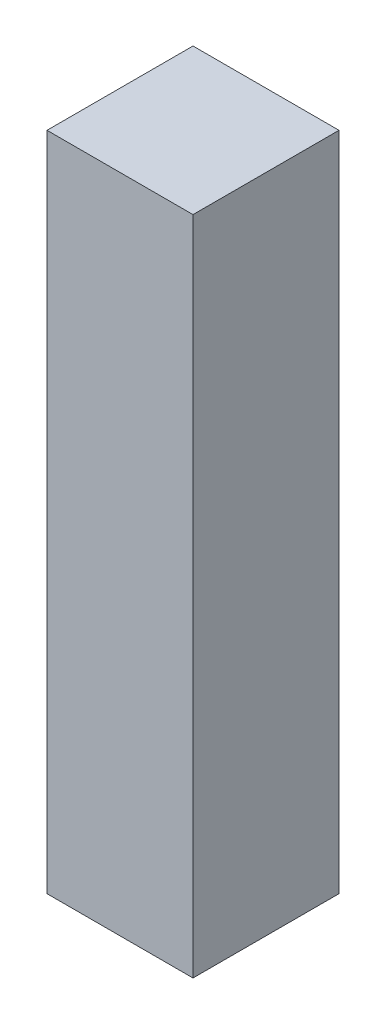
ISO-10303-21;
HEADER;
FILE_DESCRIPTION(('STEP AP214'),'2;1');
FILE_NAME('part.step','',(''),(''),'','','');
FILE_SCHEMA(('AUTOMOTIVE_DESIGN { 1 0 10303 214 1 1 1 1 }'));
ENDSEC;
DATA;
#1=APPLICATION_CONTEXT('core data for automotive mechanical design processes');
#2=APPLICATION_PROTOCOL_DEFINITION('international standard','automotive_design',2000,#1);
#3=PRODUCT_CONTEXT('',#1,'mechanical');
#4=PRODUCT('Part','Part','',(#3));
#5=PRODUCT_RELATED_PRODUCT_CATEGORY('part','',(#4));
#6=PRODUCT_DEFINITION_FORMATION('','',#4);
#7=PRODUCT_DEFINITION_CONTEXT('part definition',#1,'design');
#8=PRODUCT_DEFINITION('design','',#6,#7);
#9=PRODUCT_DEFINITION_SHAPE('','',#8);
#10=(LENGTH_UNIT() NAMED_UNIT(*) SI_UNIT(.MILLI.,.METRE.));
#11=(NAMED_UNIT(*) PLANE_ANGLE_UNIT() SI_UNIT($,.RADIAN.));
#12=(NAMED_UNIT(*) SI_UNIT($,.STERADIAN.) SOLID_ANGLE_UNIT());
#13=UNCERTAINTY_MEASURE_WITH_UNIT(LENGTH_MEASURE(1.E-05),#10,'distance_accuracy_value','');
#14=(GEOMETRIC_REPRESENTATION_CONTEXT(3) GLOBAL_UNCERTAINTY_ASSIGNED_CONTEXT((#13)) GLOBAL_UNIT_ASSIGNED_CONTEXT((#10,
#11,#12)) REPRESENTATION_CONTEXT('',''));
#15=CARTESIAN_POINT('',(0.,0.,0.));
#16=DIRECTION('',(0.,0.,1.));
#17=DIRECTION('',(1.,0.,0.));
#18=AXIS2_PLACEMENT_3D('',#15,#16,#17);
#19=CARTESIAN_POINT('',(1.325,12.,1.325));
#20=DIRECTION('',(-1.,0.,0.));
#21=DIRECTION('',(0.,0.,1.));
#22=AXIS2_PLACEMENT_3D('',#19,#20,#21);
#23=PLANE('',#22);
#24=DIRECTION('',(0.,0.,-1.));
#25=VECTOR('',#24,1.);
#26=CARTESIAN_POINT('',(1.325,0.,1.325));
#27=LINE('',#26,#25);
#28=CARTESIAN_POINT('',(1.325,0.,1.325));
#29=VERTEX_POINT('',#28);
#30=CARTESIAN_POINT('',(1.325,0.,-1.325));
#31=VERTEX_POINT('',#30);
#32=EDGE_CURVE('E113',#29,#31,#27,.T.);
#33=ORIENTED_EDGE('',*,*,#32,.T.);
#34=DIRECTION('',(0.,-1.,0.));
#35=VECTOR('',#34,1.);
#36=CARTESIAN_POINT('',(1.325,12.,-1.325));
#37=LINE('',#36,#35);
#38=CARTESIAN_POINT('',(1.325,12.,-1.325));
#39=VERTEX_POINT('',#38);
#40=EDGE_CURVE('E11',#39,#31,#37,.T.);
#41=ORIENTED_EDGE('',*,*,#40,.F.);
#42=DIRECTION('',(0.,0.,-1.));
#43=VECTOR('',#42,1.);
#44=CARTESIAN_POINT('',(1.325,12.,1.325));
#45=LINE('',#44,#43);
#46=CARTESIAN_POINT('',(1.325,12.,1.325));
#47=VERTEX_POINT('',#46);
#48=EDGE_CURVE('E97',#47,#39,#45,.T.);
#49=ORIENTED_EDGE('',*,*,#48,.F.);
#50=DIRECTION('',(0.,-1.,0.));
#51=VECTOR('',#50,1.);
#52=CARTESIAN_POINT('',(1.325,12.,1.325));
#53=LINE('',#52,#51);
#54=EDGE_CURVE('E109',#47,#29,#53,.T.);
#55=ORIENTED_EDGE('',*,*,#54,.T.);
#56=EDGE_LOOP('',(#33,#41,#49,#55));
#57=FACE_BOUND('',#56,.T.);
#58=ADVANCED_FACE('F45',(#57),#23,.F.);
#59=CARTESIAN_POINT('',(-1.325,12.,-1.325));
#60=DIRECTION('',(0.,0.,1.));
#61=DIRECTION('',(1.,0.,0.));
#62=AXIS2_PLACEMENT_3D('',#59,#60,#61);
#63=PLANE('',#62);
#64=DIRECTION('',(-1.,0.,0.));
#65=VECTOR('',#64,1.);
#66=CARTESIAN_POINT('',(-1.325,0.,-1.325));
#67=LINE('',#66,#65);
#68=CARTESIAN_POINT('',(-1.325,0.,-1.325));
#69=VERTEX_POINT('',#68);
#70=EDGE_CURVE('E102',#31,#69,#67,.T.);
#71=ORIENTED_EDGE('',*,*,#70,.T.);
#72=DIRECTION('',(0.,-1.,0.));
#73=VECTOR('',#72,1.);
#74=CARTESIAN_POINT('',(-1.325,12.,-1.325));
#75=LINE('',#74,#73);
#76=CARTESIAN_POINT('',(-1.325,12.,-1.325));
#77=VERTEX_POINT('',#76);
#78=EDGE_CURVE('E54',#77,#69,#75,.T.);
#79=ORIENTED_EDGE('',*,*,#78,.F.);
#80=DIRECTION('',(-1.,0.,0.));
#81=VECTOR('',#80,1.);
#82=CARTESIAN_POINT('',(-1.325,12.,-1.325));
#83=LINE('',#82,#81);
#84=EDGE_CURVE('E92',#39,#77,#83,.T.);
#85=ORIENTED_EDGE('',*,*,#84,.F.);
#86=ORIENTED_EDGE('',*,*,#40,.T.);
#87=EDGE_LOOP('',(#71,#79,#85,#86));
#88=FACE_BOUND('',#87,.T.);
#89=ADVANCED_FACE('F101',(#88),#63,.F.);
#90=CARTESIAN_POINT('',(-1.325,12.,1.325));
#91=DIRECTION('',(1.,0.,0.));
#92=DIRECTION('',(0.,0.,-1.));
#93=AXIS2_PLACEMENT_3D('',#90,#91,#92);
#94=PLANE('',#93);
#95=DIRECTION('',(0.,0.,1.));
#96=VECTOR('',#95,1.);
#97=CARTESIAN_POINT('',(-1.325,0.,1.325));
#98=LINE('',#97,#96);
#99=CARTESIAN_POINT('',(-1.325,0.,1.325));
#100=VERTEX_POINT('',#99);
#101=EDGE_CURVE('E79',#69,#100,#98,.T.);
#102=ORIENTED_EDGE('',*,*,#101,.T.);
#103=DIRECTION('',(0.,-1.,0.));
#104=VECTOR('',#103,1.);
#105=CARTESIAN_POINT('',(-1.325,12.,1.325));
#106=LINE('',#105,#104);
#107=CARTESIAN_POINT('',(-1.325,12.,1.325));
#108=VERTEX_POINT('',#107);
#109=EDGE_CURVE('E104',#108,#100,#106,.T.);
#110=ORIENTED_EDGE('',*,*,#109,.F.);
#111=DIRECTION('',(0.,0.,1.));
#112=VECTOR('',#111,1.);
#113=CARTESIAN_POINT('',(-1.325,12.,1.325));
#114=LINE('',#113,#112);
#115=EDGE_CURVE('E95',#77,#108,#114,.T.);
#116=ORIENTED_EDGE('',*,*,#115,.F.);
#117=ORIENTED_EDGE('',*,*,#78,.T.);
#118=EDGE_LOOP('',(#102,#110,#116,#117));
#119=FACE_BOUND('',#118,.T.);
#120=ADVANCED_FACE('F105',(#119),#94,.F.);
#121=CARTESIAN_POINT('',(-1.325,12.,1.325));
#122=DIRECTION('',(0.,0.,-1.));
#123=DIRECTION('',(-1.,0.,0.));
#124=AXIS2_PLACEMENT_3D('',#121,#122,#123);
#125=PLANE('',#124);
#126=DIRECTION('',(1.,0.,0.));
#127=VECTOR('',#126,1.);
#128=CARTESIAN_POINT('',(-1.325,0.,1.325));
#129=LINE('',#128,#127);
#130=EDGE_CURVE('E85',#100,#29,#129,.T.);
#131=ORIENTED_EDGE('',*,*,#130,.T.);
#132=ORIENTED_EDGE('',*,*,#54,.F.);
#133=DIRECTION('',(1.,0.,0.));
#134=VECTOR('',#133,1.);
#135=CARTESIAN_POINT('',(-1.325,12.,1.325));
#136=LINE('',#135,#134);
#137=EDGE_CURVE('E62',#108,#47,#136,.T.);
#138=ORIENTED_EDGE('',*,*,#137,.F.);
#139=ORIENTED_EDGE('',*,*,#109,.T.);
#140=EDGE_LOOP('',(#131,#132,#138,#139));
#141=FACE_BOUND('',#140,.T.);
#142=ADVANCED_FACE('F126',(#141),#125,.F.);
#143=CARTESIAN_POINT('',(0.,12.,0.));
#144=DIRECTION('',(0.,-1.,0.));
#145=DIRECTION('',(0.,0.,-1.));
#146=AXIS2_PLACEMENT_3D('',#143,#144,#145);
#147=PLANE('',#146);
#148=ORIENTED_EDGE('',*,*,#48,.T.);
#149=ORIENTED_EDGE('',*,*,#84,.T.);
#150=ORIENTED_EDGE('',*,*,#115,.T.);
#151=ORIENTED_EDGE('',*,*,#137,.T.);
#152=EDGE_LOOP('',(#148,#149,#150,#151));
#153=FACE_BOUND('',#152,.T.);
#154=ADVANCED_FACE('F93',(#153),#147,.F.);
#155=CARTESIAN_POINT('',(0.,0.,0.));
#156=DIRECTION('',(0.,-1.,0.));
#157=DIRECTION('',(0.,0.,-1.));
#158=AXIS2_PLACEMENT_3D('',#155,#156,#157);
#159=PLANE('',#158);
#160=ORIENTED_EDGE('',*,*,#32,.F.);
#161=ORIENTED_EDGE('',*,*,#130,.F.);
#162=ORIENTED_EDGE('',*,*,#101,.F.);
#163=ORIENTED_EDGE('',*,*,#70,.F.);
#164=EDGE_LOOP('',(#160,#161,#162,#163));
#165=FACE_BOUND('',#164,.T.);
#166=ADVANCED_FACE('F129',(#165),#159,.T.);
#167=CLOSED_SHELL('',(#58,#89,#120,#142,#154,#166));
#168=MANIFOLD_SOLID_BREP('B2',#167);
#169=ADVANCED_BREP_SHAPE_REPRESENTATION('',(#18,#168),#14);
#170=SHAPE_DEFINITION_REPRESENTATION(#9,#169);
ENDSEC;
END-ISO-10303-21;
